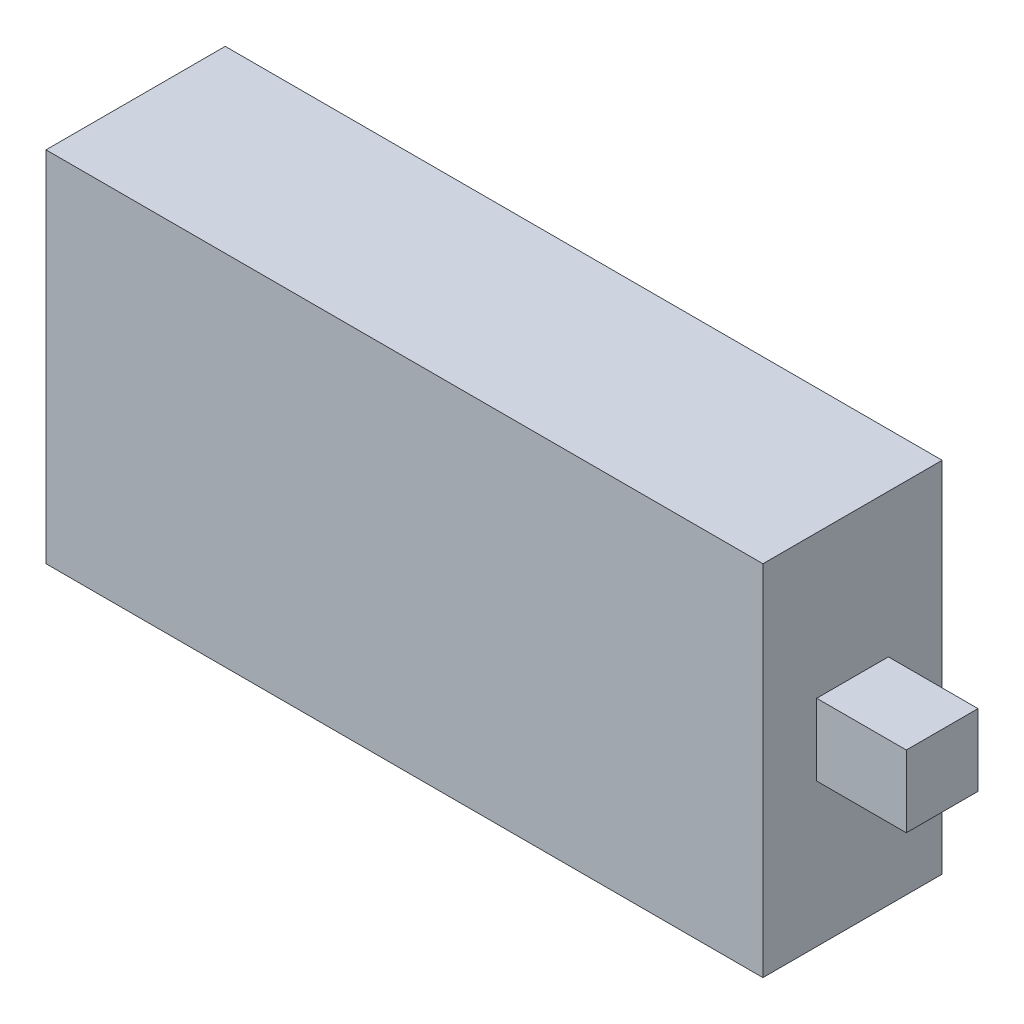
ISO-10303-21;
HEADER;
FILE_DESCRIPTION(('STEP AP214'),'2;1');
FILE_NAME('part.step','',(''),(''),'','','');
FILE_SCHEMA(('AUTOMOTIVE_DESIGN { 1 0 10303 214 1 1 1 1 }'));
ENDSEC;
DATA;
#1=APPLICATION_CONTEXT('core data for automotive mechanical design processes');
#2=APPLICATION_PROTOCOL_DEFINITION('international standard','automotive_design',2000,#1);
#3=PRODUCT_CONTEXT('',#1,'mechanical');
#4=PRODUCT('Part','Part','',(#3));
#5=PRODUCT_RELATED_PRODUCT_CATEGORY('part','',(#4));
#6=PRODUCT_DEFINITION_FORMATION('','',#4);
#7=PRODUCT_DEFINITION_CONTEXT('part definition',#1,'design');
#8=PRODUCT_DEFINITION('design','',#6,#7);
#9=PRODUCT_DEFINITION_SHAPE('','',#8);
#10=(LENGTH_UNIT() NAMED_UNIT(*) SI_UNIT(.MILLI.,.METRE.));
#11=(NAMED_UNIT(*) PLANE_ANGLE_UNIT() SI_UNIT($,.RADIAN.));
#12=(NAMED_UNIT(*) SI_UNIT($,.STERADIAN.) SOLID_ANGLE_UNIT());
#13=UNCERTAINTY_MEASURE_WITH_UNIT(LENGTH_MEASURE(1.E-05),#10,'distance_accuracy_value','');
#14=(GEOMETRIC_REPRESENTATION_CONTEXT(3) GLOBAL_UNCERTAINTY_ASSIGNED_CONTEXT((#13)) GLOBAL_UNIT_ASSIGNED_CONTEXT((#10,
#11,#12)) REPRESENTATION_CONTEXT('',''));
#15=CARTESIAN_POINT('',(0.,0.,0.));
#16=DIRECTION('',(0.,0.,1.));
#17=DIRECTION('',(1.,0.,0.));
#18=AXIS2_PLACEMENT_3D('',#15,#16,#17);
#19=CARTESIAN_POINT('',(40.,0.,10.));
#20=DIRECTION('',(-1.,0.,0.));
#21=DIRECTION('',(0.,0.,1.));
#22=AXIS2_PLACEMENT_3D('',#19,#20,#21);
#23=PLANE('',#22);
#24=DIRECTION('',(0.,1.,0.));
#25=VECTOR('',#24,1.);
#26=CARTESIAN_POINT('',(40.,0.,0.));
#27=LINE('',#26,#25);
#28=CARTESIAN_POINT('',(40.,0.,0.));
#29=VERTEX_POINT('',#28);
#30=CARTESIAN_POINT('',(40.,20.,0.));
#31=VERTEX_POINT('',#30);
#32=EDGE_CURVE('E147',#29,#31,#27,.T.);
#33=ORIENTED_EDGE('',*,*,#32,.T.);
#34=DIRECTION('',(0.,0.,-1.));
#35=VECTOR('',#34,1.);
#36=CARTESIAN_POINT('',(40.,20.,10.));
#37=LINE('',#36,#35);
#38=CARTESIAN_POINT('',(40.,20.,10.));
#39=VERTEX_POINT('',#38);
#40=EDGE_CURVE('E152',#39,#31,#37,.T.);
#41=ORIENTED_EDGE('',*,*,#40,.F.);
#42=DIRECTION('',(0.,1.,0.));
#43=VECTOR('',#42,1.);
#44=CARTESIAN_POINT('',(40.,0.,10.));
#45=LINE('',#44,#43);
#46=CARTESIAN_POINT('',(40.,0.,10.));
#47=VERTEX_POINT('',#46);
#48=EDGE_CURVE('E141',#47,#39,#45,.T.);
#49=ORIENTED_EDGE('',*,*,#48,.F.);
#50=DIRECTION('',(0.,0.,-1.));
#51=VECTOR('',#50,1.);
#52=CARTESIAN_POINT('',(40.,0.,10.));
#53=LINE('',#52,#51);
#54=EDGE_CURVE('E49',#47,#29,#53,.T.);
#55=ORIENTED_EDGE('',*,*,#54,.T.);
#56=EDGE_LOOP('',(#33,#41,#49,#55));
#57=FACE_BOUND('',#56,.T.);
#58=DIRECTION('',(0.,-1.,0.));
#59=VECTOR('',#58,1.);
#60=CARTESIAN_POINT('',(40.,12.,7.));
#61=LINE('',#60,#59);
#62=CARTESIAN_POINT('',(40.,12.,7.));
#63=VERTEX_POINT('',#62);
#64=CARTESIAN_POINT('',(40.,8.,7.));
#65=VERTEX_POINT('',#64);
#66=EDGE_CURVE('E56',#63,#65,#61,.T.);
#67=ORIENTED_EDGE('',*,*,#66,.F.);
#68=DIRECTION('',(0.,0.,1.));
#69=VECTOR('',#68,1.);
#70=CARTESIAN_POINT('',(40.,12.,3.));
#71=LINE('',#70,#69);
#72=CARTESIAN_POINT('',(40.,12.,3.));
#73=VERTEX_POINT('',#72);
#74=EDGE_CURVE('E60',#73,#63,#71,.T.);
#75=ORIENTED_EDGE('',*,*,#74,.F.);
#76=DIRECTION('',(0.,1.,0.));
#77=VECTOR('',#76,1.);
#78=CARTESIAN_POINT('',(40.,8.,3.));
#79=LINE('',#78,#77);
#80=CARTESIAN_POINT('',(40.,8.,3.));
#81=VERTEX_POINT('',#80);
#82=EDGE_CURVE('E268',#81,#73,#79,.T.);
#83=ORIENTED_EDGE('',*,*,#82,.F.);
#84=DIRECTION('',(0.,0.,-1.));
#85=VECTOR('',#84,1.);
#86=CARTESIAN_POINT('',(40.,8.,7.));
#87=LINE('',#86,#85);
#88=EDGE_CURVE('E274',#65,#81,#87,.T.);
#89=ORIENTED_EDGE('',*,*,#88,.F.);
#90=EDGE_LOOP('',(#67,#75,#83,#89));
#91=FACE_BOUND('',#90,.T.);
#92=ADVANCED_FACE('F41',(#57,#91),#23,.F.);
#93=CARTESIAN_POINT('',(0.,20.,10.));
#94=DIRECTION('',(1.,0.,0.));
#95=DIRECTION('',(0.,0.,-1.));
#96=AXIS2_PLACEMENT_3D('',#93,#94,#95);
#97=PLANE('',#96);
#98=DIRECTION('',(0.,-1.,0.));
#99=VECTOR('',#98,1.);
#100=CARTESIAN_POINT('',(0.,20.,0.));
#101=LINE('',#100,#99);
#102=CARTESIAN_POINT('',(0.,20.,0.));
#103=VERTEX_POINT('',#102);
#104=CARTESIAN_POINT('',(0.,0.,0.));
#105=VERTEX_POINT('',#104);
#106=EDGE_CURVE('E126',#103,#105,#101,.T.);
#107=ORIENTED_EDGE('',*,*,#106,.T.);
#108=DIRECTION('',(0.,0.,-1.));
#109=VECTOR('',#108,1.);
#110=CARTESIAN_POINT('',(0.,0.,10.));
#111=LINE('',#110,#109);
#112=CARTESIAN_POINT('',(0.,0.,10.));
#113=VERTEX_POINT('',#112);
#114=EDGE_CURVE('E11',#113,#105,#111,.T.);
#115=ORIENTED_EDGE('',*,*,#114,.F.);
#116=DIRECTION('',(0.,-1.,0.));
#117=VECTOR('',#116,1.);
#118=CARTESIAN_POINT('',(0.,20.,10.));
#119=LINE('',#118,#117);
#120=CARTESIAN_POINT('',(0.,20.,10.));
#121=VERTEX_POINT('',#120);
#122=EDGE_CURVE('E135',#121,#113,#119,.T.);
#123=ORIENTED_EDGE('',*,*,#122,.F.);
#124=DIRECTION('',(0.,0.,-1.));
#125=VECTOR('',#124,1.);
#126=CARTESIAN_POINT('',(0.,20.,10.));
#127=LINE('',#126,#125);
#128=EDGE_CURVE('E144',#121,#103,#127,.T.);
#129=ORIENTED_EDGE('',*,*,#128,.T.);
#130=EDGE_LOOP('',(#107,#115,#123,#129));
#131=FACE_BOUND('',#130,.T.);
#132=ADVANCED_FACE('F43',(#131),#97,.F.);
#133=CARTESIAN_POINT('',(0.,0.,10.));
#134=DIRECTION('',(0.,1.,0.));
#135=DIRECTION('',(0.,0.,1.));
#136=AXIS2_PLACEMENT_3D('',#133,#134,#135);
#137=PLANE('',#136);
#138=DIRECTION('',(1.,0.,0.));
#139=VECTOR('',#138,1.);
#140=CARTESIAN_POINT('',(0.,0.,0.));
#141=LINE('',#140,#139);
#142=EDGE_CURVE('E129',#105,#29,#141,.T.);
#143=ORIENTED_EDGE('',*,*,#142,.T.);
#144=ORIENTED_EDGE('',*,*,#54,.F.);
#145=DIRECTION('',(1.,0.,0.));
#146=VECTOR('',#145,1.);
#147=CARTESIAN_POINT('',(0.,0.,10.));
#148=LINE('',#147,#146);
#149=EDGE_CURVE('E138',#113,#47,#148,.T.);
#150=ORIENTED_EDGE('',*,*,#149,.F.);
#151=ORIENTED_EDGE('',*,*,#114,.T.);
#152=EDGE_LOOP('',(#143,#144,#150,#151));
#153=FACE_BOUND('',#152,.T.);
#154=ADVANCED_FACE('F174',(#153),#137,.F.);
#155=CARTESIAN_POINT('',(40.,20.,10.));
#156=DIRECTION('',(0.,-1.,0.));
#157=DIRECTION('',(0.,0.,-1.));
#158=AXIS2_PLACEMENT_3D('',#155,#156,#157);
#159=PLANE('',#158);
#160=DIRECTION('',(-1.,0.,0.));
#161=VECTOR('',#160,1.);
#162=CARTESIAN_POINT('',(40.,20.,0.));
#163=LINE('',#162,#161);
#164=EDGE_CURVE('E139',#31,#103,#163,.T.);
#165=ORIENTED_EDGE('',*,*,#164,.T.);
#166=ORIENTED_EDGE('',*,*,#128,.F.);
#167=DIRECTION('',(-1.,0.,0.));
#168=VECTOR('',#167,1.);
#169=CARTESIAN_POINT('',(40.,20.,10.));
#170=LINE('',#169,#168);
#171=EDGE_CURVE('E143',#39,#121,#170,.T.);
#172=ORIENTED_EDGE('',*,*,#171,.F.);
#173=ORIENTED_EDGE('',*,*,#40,.T.);
#174=EDGE_LOOP('',(#165,#166,#172,#173));
#175=FACE_BOUND('',#174,.T.);
#176=ADVANCED_FACE('F167',(#175),#159,.F.);
#177=CARTESIAN_POINT('',(0.,0.,10.));
#178=DIRECTION('',(0.,0.,1.));
#179=DIRECTION('',(1.,0.,0.));
#180=AXIS2_PLACEMENT_3D('',#177,#178,#179);
#181=PLANE('',#180);
#182=ORIENTED_EDGE('',*,*,#122,.T.);
#183=ORIENTED_EDGE('',*,*,#149,.T.);
#184=ORIENTED_EDGE('',*,*,#48,.T.);
#185=ORIENTED_EDGE('',*,*,#171,.T.);
#186=EDGE_LOOP('',(#182,#183,#184,#185));
#187=FACE_BOUND('',#186,.T.);
#188=ADVANCED_FACE('F173',(#187),#181,.T.);
#189=CARTESIAN_POINT('',(0.,0.,0.));
#190=DIRECTION('',(0.,0.,1.));
#191=DIRECTION('',(1.,0.,0.));
#192=AXIS2_PLACEMENT_3D('',#189,#190,#191);
#193=PLANE('',#192);
#194=ORIENTED_EDGE('',*,*,#106,.F.);
#195=ORIENTED_EDGE('',*,*,#164,.F.);
#196=ORIENTED_EDGE('',*,*,#32,.F.);
#197=ORIENTED_EDGE('',*,*,#142,.F.);
#198=EDGE_LOOP('',(#194,#195,#196,#197));
#199=FACE_BOUND('',#198,.T.);
#200=ADVANCED_FACE('F164',(#199),#193,.F.);
#201=CARTESIAN_POINT('',(45.,12.,7.));
#202=DIRECTION('',(0.,0.,-1.));
#203=DIRECTION('',(-1.,0.,0.));
#204=AXIS2_PLACEMENT_3D('',#201,#202,#203);
#205=PLANE('',#204);
#206=ORIENTED_EDGE('',*,*,#66,.T.);
#207=DIRECTION('',(-1.,0.,0.));
#208=VECTOR('',#207,1.);
#209=CARTESIAN_POINT('',(45.,8.,7.));
#210=LINE('',#209,#208);
#211=CARTESIAN_POINT('',(45.,8.,7.));
#212=VERTEX_POINT('',#211);
#213=EDGE_CURVE('E109',#212,#65,#210,.T.);
#214=ORIENTED_EDGE('',*,*,#213,.F.);
#215=DIRECTION('',(0.,-1.,0.));
#216=VECTOR('',#215,1.);
#217=CARTESIAN_POINT('',(45.,12.,7.));
#218=LINE('',#217,#216);
#219=CARTESIAN_POINT('',(45.,12.,7.));
#220=VERTEX_POINT('',#219);
#221=EDGE_CURVE('E115',#220,#212,#218,.T.);
#222=ORIENTED_EDGE('',*,*,#221,.F.);
#223=DIRECTION('',(-1.,0.,0.));
#224=VECTOR('',#223,1.);
#225=CARTESIAN_POINT('',(45.,12.,7.));
#226=LINE('',#225,#224);
#227=EDGE_CURVE('E266',#220,#63,#226,.T.);
#228=ORIENTED_EDGE('',*,*,#227,.T.);
#229=EDGE_LOOP('',(#206,#214,#222,#228));
#230=FACE_BOUND('',#229,.T.);
#231=ADVANCED_FACE('F125',(#230),#205,.F.);
#232=CARTESIAN_POINT('',(45.,8.,7.));
#233=DIRECTION('',(0.,1.,0.));
#234=DIRECTION('',(0.,0.,1.));
#235=AXIS2_PLACEMENT_3D('',#232,#233,#234);
#236=PLANE('',#235);
#237=ORIENTED_EDGE('',*,*,#88,.T.);
#238=DIRECTION('',(-1.,0.,0.));
#239=VECTOR('',#238,1.);
#240=CARTESIAN_POINT('',(45.,8.,3.));
#241=LINE('',#240,#239);
#242=CARTESIAN_POINT('',(45.,8.,3.));
#243=VERTEX_POINT('',#242);
#244=EDGE_CURVE('E111',#243,#81,#241,.T.);
#245=ORIENTED_EDGE('',*,*,#244,.F.);
#246=DIRECTION('',(0.,0.,-1.));
#247=VECTOR('',#246,1.);
#248=CARTESIAN_POINT('',(45.,8.,7.));
#249=LINE('',#248,#247);
#250=EDGE_CURVE('E104',#212,#243,#249,.T.);
#251=ORIENTED_EDGE('',*,*,#250,.F.);
#252=ORIENTED_EDGE('',*,*,#213,.T.);
#253=EDGE_LOOP('',(#237,#245,#251,#252));
#254=FACE_BOUND('',#253,.T.);
#255=ADVANCED_FACE('F107',(#254),#236,.F.);
#256=CARTESIAN_POINT('',(45.,8.,3.));
#257=DIRECTION('',(0.,0.,1.));
#258=DIRECTION('',(1.,0.,0.));
#259=AXIS2_PLACEMENT_3D('',#256,#257,#258);
#260=PLANE('',#259);
#261=ORIENTED_EDGE('',*,*,#82,.T.);
#262=DIRECTION('',(-1.,0.,0.));
#263=VECTOR('',#262,1.);
#264=CARTESIAN_POINT('',(45.,12.,3.));
#265=LINE('',#264,#263);
#266=CARTESIAN_POINT('',(45.,12.,3.));
#267=VERTEX_POINT('',#266);
#268=EDGE_CURVE('E131',#267,#73,#265,.T.);
#269=ORIENTED_EDGE('',*,*,#268,.F.);
#270=DIRECTION('',(0.,1.,0.));
#271=VECTOR('',#270,1.);
#272=CARTESIAN_POINT('',(45.,8.,3.));
#273=LINE('',#272,#271);
#274=EDGE_CURVE('E114',#243,#267,#273,.T.);
#275=ORIENTED_EDGE('',*,*,#274,.F.);
#276=ORIENTED_EDGE('',*,*,#244,.T.);
#277=EDGE_LOOP('',(#261,#269,#275,#276));
#278=FACE_BOUND('',#277,.T.);
#279=ADVANCED_FACE('F194',(#278),#260,.F.);
#280=CARTESIAN_POINT('',(45.,12.,3.));
#281=DIRECTION('',(0.,-1.,0.));
#282=DIRECTION('',(0.,0.,-1.));
#283=AXIS2_PLACEMENT_3D('',#280,#281,#282);
#284=PLANE('',#283);
#285=ORIENTED_EDGE('',*,*,#74,.T.);
#286=ORIENTED_EDGE('',*,*,#227,.F.);
#287=DIRECTION('',(0.,0.,1.));
#288=VECTOR('',#287,1.);
#289=CARTESIAN_POINT('',(45.,12.,3.));
#290=LINE('',#289,#288);
#291=EDGE_CURVE('E120',#267,#220,#290,.T.);
#292=ORIENTED_EDGE('',*,*,#291,.F.);
#293=ORIENTED_EDGE('',*,*,#268,.T.);
#294=EDGE_LOOP('',(#285,#286,#292,#293));
#295=FACE_BOUND('',#294,.T.);
#296=ADVANCED_FACE('F197',(#295),#284,.F.);
#297=CARTESIAN_POINT('',(45.,0.,0.));
#298=DIRECTION('',(1.,0.,0.));
#299=DIRECTION('',(0.,0.,-1.));
#300=AXIS2_PLACEMENT_3D('',#297,#298,#299);
#301=PLANE('',#300);
#302=ORIENTED_EDGE('',*,*,#221,.T.);
#303=ORIENTED_EDGE('',*,*,#250,.T.);
#304=ORIENTED_EDGE('',*,*,#274,.T.);
#305=ORIENTED_EDGE('',*,*,#291,.T.);
#306=EDGE_LOOP('',(#302,#303,#304,#305));
#307=FACE_BOUND('',#306,.T.);
#308=ADVANCED_FACE('F118',(#307),#301,.T.);
#309=CLOSED_SHELL('',(#92,#132,#154,#176,#188,#200,#231,#255,#279,#296,#308));
#310=MANIFOLD_SOLID_BREP('B2',#309);
#311=ADVANCED_BREP_SHAPE_REPRESENTATION('',(#18,#310),#14);
#312=SHAPE_DEFINITION_REPRESENTATION(#9,#311);
ENDSEC;
END-ISO-10303-21;
